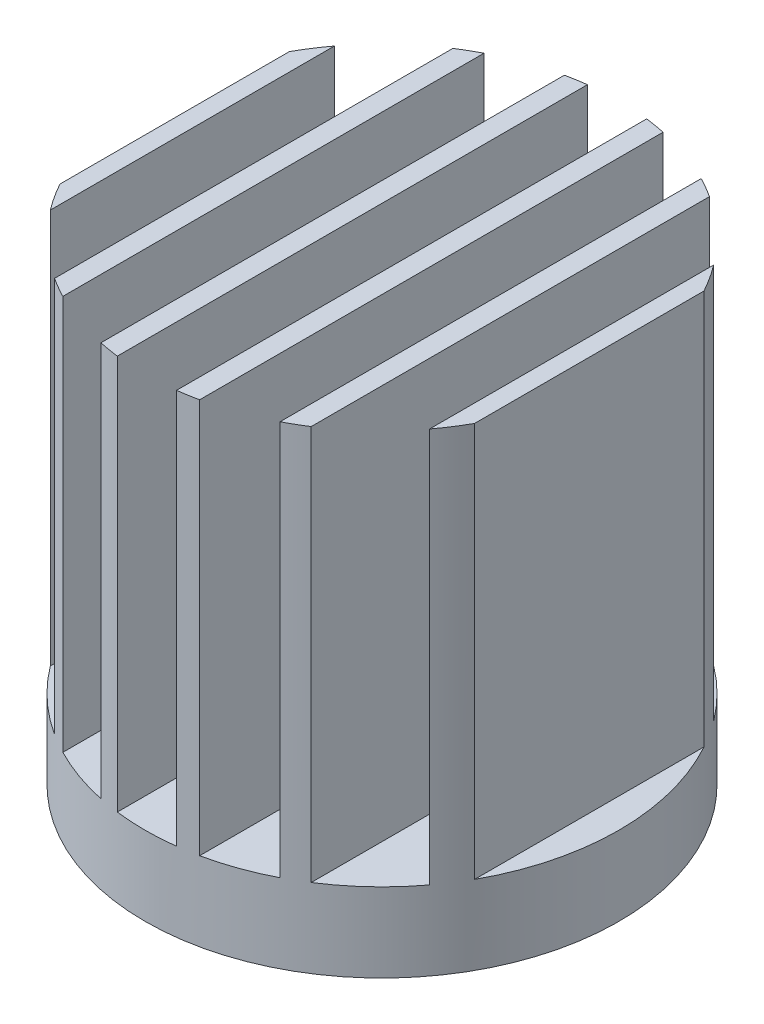
ISO-10303-21;
HEADER;
FILE_DESCRIPTION(('STEP AP214'),'2;1');
FILE_NAME('part.step','',(''),(''),'','','');
FILE_SCHEMA(('AUTOMOTIVE_DESIGN { 1 0 10303 214 1 1 1 1 }'));
ENDSEC;
DATA;
#1=APPLICATION_CONTEXT('core data for automotive mechanical design processes');
#2=APPLICATION_PROTOCOL_DEFINITION('international standard','automotive_design',2000,#1);
#3=PRODUCT_CONTEXT('',#1,'mechanical');
#4=PRODUCT('Part','Part','',(#3));
#5=PRODUCT_RELATED_PRODUCT_CATEGORY('part','',(#4));
#6=PRODUCT_DEFINITION_FORMATION('','',#4);
#7=PRODUCT_DEFINITION_CONTEXT('part definition',#1,'design');
#8=PRODUCT_DEFINITION('design','',#6,#7);
#9=PRODUCT_DEFINITION_SHAPE('','',#8);
#10=(LENGTH_UNIT() NAMED_UNIT(*) SI_UNIT(.MILLI.,.METRE.));
#11=(NAMED_UNIT(*) PLANE_ANGLE_UNIT() SI_UNIT($,.RADIAN.));
#12=(NAMED_UNIT(*) SI_UNIT($,.STERADIAN.) SOLID_ANGLE_UNIT());
#13=UNCERTAINTY_MEASURE_WITH_UNIT(LENGTH_MEASURE(1.E-05),#10,'distance_accuracy_value','');
#14=(GEOMETRIC_REPRESENTATION_CONTEXT(3) GLOBAL_UNCERTAINTY_ASSIGNED_CONTEXT((#13)) GLOBAL_UNIT_ASSIGNED_CONTEXT((#10,
#11,#12)) REPRESENTATION_CONTEXT('',''));
#15=CARTESIAN_POINT('',(0.,0.,0.));
#16=DIRECTION('',(0.,0.,1.));
#17=DIRECTION('',(1.,0.,0.));
#18=AXIS2_PLACEMENT_3D('',#15,#16,#17);
#19=CARTESIAN_POINT('',(0.,120.,0.));
#20=DIRECTION('',(0.,1.,0.));
#21=DIRECTION('',(0.,0.,1.));
#22=AXIS2_PLACEMENT_3D('',#19,#20,#21);
#23=PLANE('',#22);
#24=DIRECTION('',(0.,0.,1.));
#25=VECTOR('',#24,1.);
#26=CARTESIAN_POINT('',(-27.5,120.,0.));
#27=LINE('',#26,#25);
#28=CARTESIAN_POINT('',(-27.5,120.,-53.3268225192539));
#29=VERTEX_POINT('',#28);
#30=CARTESIAN_POINT('',(-27.5,120.,53.3268225192539));
#31=VERTEX_POINT('',#30);
#32=EDGE_CURVE('E265',#29,#31,#27,.T.);
#33=ORIENTED_EDGE('',*,*,#32,.F.);
#34=CARTESIAN_POINT('',(0.,120.,0.));
#35=DIRECTION('',(0.,1.,0.));
#36=DIRECTION('',(0.,0.,1.));
#37=AXIS2_PLACEMENT_3D('',#34,#35,#36);
#38=CIRCLE('',#37,60.);
#39=CARTESIAN_POINT('',(-32.5,120.,-50.43560250458));
#40=VERTEX_POINT('',#39);
#41=EDGE_CURVE('E398',#29,#40,#38,.T.);
#42=ORIENTED_EDGE('',*,*,#41,.T.);
#43=DIRECTION('',(0.,0.,-1.));
#44=VECTOR('',#43,1.);
#45=CARTESIAN_POINT('',(-32.5,120.,0.));
#46=LINE('',#45,#44);
#47=CARTESIAN_POINT('',(-32.5,120.,50.43560250458));
#48=VERTEX_POINT('',#47);
#49=EDGE_CURVE('E257',#48,#40,#46,.T.);
#50=ORIENTED_EDGE('',*,*,#49,.F.);
#51=EDGE_CURVE('E243',#48,#31,#38,.T.);
#52=ORIENTED_EDGE('',*,*,#51,.T.);
#53=EDGE_LOOP('',(#33,#42,#50,#52));
#54=FACE_BOUND('',#53,.T.);
#55=ADVANCED_FACE('F45',(#54),#23,.T.);
#56=DIRECTION('',(0.,0.,-1.));
#57=VECTOR('',#56,1.);
#58=CARTESIAN_POINT('',(27.5,120.,0.));
#59=LINE('',#58,#57);
#60=CARTESIAN_POINT('',(27.5,120.,53.3268225192539));
#61=VERTEX_POINT('',#60);
#62=CARTESIAN_POINT('',(27.5,120.,-53.3268225192539));
#63=VERTEX_POINT('',#62);
#64=EDGE_CURVE('E261',#61,#63,#59,.T.);
#65=ORIENTED_EDGE('',*,*,#64,.F.);
#66=CARTESIAN_POINT('',(32.5,120.,50.43560250458));
#67=VERTEX_POINT('',#66);
#68=EDGE_CURVE('E234',#61,#67,#38,.T.);
#69=ORIENTED_EDGE('',*,*,#68,.T.);
#70=DIRECTION('',(0.,0.,1.));
#71=VECTOR('',#70,1.);
#72=CARTESIAN_POINT('',(32.5,120.,0.));
#73=LINE('',#72,#71);
#74=CARTESIAN_POINT('',(32.5,120.,-50.43560250458));
#75=VERTEX_POINT('',#74);
#76=EDGE_CURVE('E249',#75,#67,#73,.T.);
#77=ORIENTED_EDGE('',*,*,#76,.F.);
#78=EDGE_CURVE('E238',#75,#63,#38,.T.);
#79=ORIENTED_EDGE('',*,*,#78,.T.);
#80=EDGE_LOOP('',(#65,#69,#77,#79));
#81=FACE_BOUND('',#80,.T.);
#82=ADVANCED_FACE('F447',(#81),#23,.T.);
#83=DIRECTION('',(0.,0.,-1.));
#84=VECTOR('',#83,1.);
#85=CARTESIAN_POINT('',(-12.5,120.,0.));
#86=LINE('',#85,#84);
#87=CARTESIAN_POINT('',(-12.5,120.,58.6834729715275));
#88=VERTEX_POINT('',#87);
#89=CARTESIAN_POINT('',(-12.5,120.,-58.6834729715275));
#90=VERTEX_POINT('',#89);
#91=EDGE_CURVE('E263',#88,#90,#86,.T.);
#92=ORIENTED_EDGE('',*,*,#91,.F.);
#93=CARTESIAN_POINT('',(-7.5,120.,59.5294044989533));
#94=VERTEX_POINT('',#93);
#95=EDGE_CURVE('E239',#88,#94,#38,.T.);
#96=ORIENTED_EDGE('',*,*,#95,.T.);
#97=DIRECTION('',(0.,0.,1.));
#98=VECTOR('',#97,1.);
#99=CARTESIAN_POINT('',(-7.5,120.,0.));
#100=LINE('',#99,#98);
#101=CARTESIAN_POINT('',(-7.5,120.,-59.5294044989533));
#102=VERTEX_POINT('',#101);
#103=EDGE_CURVE('E251',#102,#94,#100,.T.);
#104=ORIENTED_EDGE('',*,*,#103,.F.);
#105=EDGE_CURVE('E419',#102,#90,#38,.T.);
#106=ORIENTED_EDGE('',*,*,#105,.T.);
#107=EDGE_LOOP('',(#92,#96,#104,#106));
#108=FACE_BOUND('',#107,.T.);
#109=ADVANCED_FACE('F416',(#108),#23,.T.);
#110=DIRECTION('',(0.,0.,1.));
#111=VECTOR('',#110,1.);
#112=CARTESIAN_POINT('',(12.5,120.,0.));
#113=LINE('',#112,#111);
#114=CARTESIAN_POINT('',(12.5,120.,-58.6834729715275));
#115=VERTEX_POINT('',#114);
#116=CARTESIAN_POINT('',(12.5,120.,58.6834729715275));
#117=VERTEX_POINT('',#116);
#118=EDGE_CURVE('E259',#115,#117,#113,.T.);
#119=ORIENTED_EDGE('',*,*,#118,.F.);
#120=CARTESIAN_POINT('',(7.5,120.,-59.5294044989533));
#121=VERTEX_POINT('',#120);
#122=EDGE_CURVE('E421',#115,#121,#38,.T.);
#123=ORIENTED_EDGE('',*,*,#122,.T.);
#124=DIRECTION('',(0.,0.,-1.));
#125=VECTOR('',#124,1.);
#126=CARTESIAN_POINT('',(7.5,120.,0.));
#127=LINE('',#126,#125);
#128=CARTESIAN_POINT('',(7.5,120.,59.5294044989533));
#129=VERTEX_POINT('',#128);
#130=EDGE_CURVE('E253',#129,#121,#127,.T.);
#131=ORIENTED_EDGE('',*,*,#130,.F.);
#132=EDGE_CURVE('E221',#129,#117,#38,.T.);
#133=ORIENTED_EDGE('',*,*,#132,.T.);
#134=EDGE_LOOP('',(#119,#123,#131,#133));
#135=FACE_BOUND('',#134,.T.);
#136=ADVANCED_FACE('F463',(#135),#23,.T.);
#137=DIRECTION('',(0.,0.,-1.));
#138=VECTOR('',#137,1.);
#139=CARTESIAN_POINT('',(-52.5,120.,0.));
#140=LINE('',#139,#138);
#141=CARTESIAN_POINT('',(-52.5,120.,29.0473750965556));
#142=VERTEX_POINT('',#141);
#143=CARTESIAN_POINT('',(-52.5,120.,-29.0473750965556));
#144=VERTEX_POINT('',#143);
#145=EDGE_CURVE('E267',#142,#144,#140,.T.);
#146=ORIENTED_EDGE('',*,*,#145,.F.);
#147=CARTESIAN_POINT('',(-48.0171697935705,120.,35.9770955611403));
#148=VERTEX_POINT('',#147);
#149=EDGE_CURVE('E394',#142,#148,#38,.T.);
#150=ORIENTED_EDGE('',*,*,#149,.T.);
#151=DIRECTION('',(0.,0.,1.));
#152=VECTOR('',#151,1.);
#153=CARTESIAN_POINT('',(-48.0171697935705,120.,0.));
#154=LINE('',#153,#152);
#155=CARTESIAN_POINT('',(-48.0171697935705,120.,-35.9770955611403));
#156=VERTEX_POINT('',#155);
#157=EDGE_CURVE('E255',#156,#148,#154,.T.);
#158=ORIENTED_EDGE('',*,*,#157,.F.);
#159=EDGE_CURVE('E397',#156,#144,#38,.T.);
#160=ORIENTED_EDGE('',*,*,#159,.T.);
#161=EDGE_LOOP('',(#146,#150,#158,#160));
#162=FACE_BOUND('',#161,.T.);
#163=ADVANCED_FACE('F432',(#162),#23,.T.);
#164=CARTESIAN_POINT('',(0.,120.,0.));
#165=DIRECTION('',(0.,-1.,0.));
#166=DIRECTION('',(0.,0.,-1.));
#167=AXIS2_PLACEMENT_3D('',#164,#165,#166);
#168=CYLINDRICAL_SURFACE('',#167,60.);
#169=ORIENTED_EDGE('',*,*,#149,.F.);
#170=DIRECTION('',(0.,-1.,0.));
#171=VECTOR('',#170,1.);
#172=CARTESIAN_POINT('',(-52.5,120.,29.0473750965557));
#173=LINE('',#172,#171);
#174=CARTESIAN_POINT('',(-52.5,20.,29.0473750965556));
#175=VERTEX_POINT('',#174);
#176=EDGE_CURVE('E68',#142,#175,#173,.T.);
#177=ORIENTED_EDGE('',*,*,#176,.T.);
#178=CARTESIAN_POINT('',(0.,20.,0.));
#179=DIRECTION('',(0.,-1.,0.));
#180=DIRECTION('',(1.,0.,0.));
#181=AXIS2_PLACEMENT_3D('',#178,#179,#180);
#182=CIRCLE('',#181,60.);
#183=CARTESIAN_POINT('',(-52.5,20.,-29.0473750965556));
#184=VERTEX_POINT('',#183);
#185=EDGE_CURVE('E11',#175,#184,#182,.T.);
#186=ORIENTED_EDGE('',*,*,#185,.T.);
#187=DIRECTION('',(0.,-1.,0.));
#188=VECTOR('',#187,1.);
#189=CARTESIAN_POINT('',(-52.5,120.,-29.0473750965557));
#190=LINE('',#189,#188);
#191=EDGE_CURVE('E389',#184,#144,#190,.F.);
#192=ORIENTED_EDGE('',*,*,#191,.T.);
#193=ORIENTED_EDGE('',*,*,#159,.F.);
#194=DIRECTION('',(0.,-1.,0.));
#195=VECTOR('',#194,1.);
#196=CARTESIAN_POINT('',(-48.0171697935705,120.,-35.9770955611403));
#197=LINE('',#196,#195);
#198=CARTESIAN_POINT('',(-48.0171697935705,20.,-35.9770955611403));
#199=VERTEX_POINT('',#198);
#200=EDGE_CURVE('E367',#156,#199,#197,.T.);
#201=ORIENTED_EDGE('',*,*,#200,.T.);
#202=CARTESIAN_POINT('',(0.,20.,0.));
#203=DIRECTION('',(0.,-1.,0.));
#204=DIRECTION('',(0.,0.,-1.));
#205=AXIS2_PLACEMENT_3D('',#202,#203,#204);
#206=CIRCLE('',#205,60.);
#207=CARTESIAN_POINT('',(-32.5,20.,-50.43560250458));
#208=VERTEX_POINT('',#207);
#209=EDGE_CURVE('E281',#199,#208,#206,.T.);
#210=ORIENTED_EDGE('',*,*,#209,.T.);
#211=DIRECTION('',(0.,-1.,0.));
#212=VECTOR('',#211,1.);
#213=CARTESIAN_POINT('',(-32.5,120.,-50.43560250458));
#214=LINE('',#213,#212);
#215=EDGE_CURVE('E370',#208,#40,#214,.F.);
#216=ORIENTED_EDGE('',*,*,#215,.T.);
#217=ORIENTED_EDGE('',*,*,#41,.F.);
#218=DIRECTION('',(0.,-1.,0.));
#219=VECTOR('',#218,1.);
#220=CARTESIAN_POINT('',(-27.5,120.,-53.3268225192539));
#221=LINE('',#220,#219);
#222=CARTESIAN_POINT('',(-27.5,20.,-53.3268225192539));
#223=VERTEX_POINT('',#222);
#224=EDGE_CURVE('E388',#29,#223,#221,.T.);
#225=ORIENTED_EDGE('',*,*,#224,.T.);
#226=CARTESIAN_POINT('',(0.,20.,0.));
#227=DIRECTION('',(0.,-1.,0.));
#228=DIRECTION('',(0.,0.,-1.));
#229=AXIS2_PLACEMENT_3D('',#226,#227,#228);
#230=CIRCLE('',#229,60.);
#231=CARTESIAN_POINT('',(-12.5,20.,-58.6834729715275));
#232=VERTEX_POINT('',#231);
#233=EDGE_CURVE('E285',#223,#232,#230,.T.);
#234=ORIENTED_EDGE('',*,*,#233,.T.);
#235=DIRECTION('',(0.,-1.,0.));
#236=VECTOR('',#235,1.);
#237=CARTESIAN_POINT('',(-12.5,120.,-58.6834729715275));
#238=LINE('',#237,#236);
#239=EDGE_CURVE('E382',#232,#90,#238,.F.);
#240=ORIENTED_EDGE('',*,*,#239,.T.);
#241=ORIENTED_EDGE('',*,*,#105,.F.);
#242=DIRECTION('',(0.,-1.,0.));
#243=VECTOR('',#242,1.);
#244=CARTESIAN_POINT('',(-7.5,120.,-59.5294044989533));
#245=LINE('',#244,#243);
#246=CARTESIAN_POINT('',(-7.49999999999999,20.,-59.5294044989533));
#247=VERTEX_POINT('',#246);
#248=EDGE_CURVE('E355',#102,#247,#245,.T.);
#249=ORIENTED_EDGE('',*,*,#248,.T.);
#250=CARTESIAN_POINT('',(0.,20.,0.));
#251=DIRECTION('',(0.,-1.,0.));
#252=DIRECTION('',(1.,0.,0.));
#253=AXIS2_PLACEMENT_3D('',#250,#251,#252);
#254=CIRCLE('',#253,60.);
#255=CARTESIAN_POINT('',(7.49999999999999,20.0000000000001,-59.5294044989533));
#256=VERTEX_POINT('',#255);
#257=EDGE_CURVE('E277',#247,#256,#254,.T.);
#258=ORIENTED_EDGE('',*,*,#257,.T.);
#259=DIRECTION('',(0.,-1.,0.));
#260=VECTOR('',#259,1.);
#261=CARTESIAN_POINT('',(7.5,120.,-59.5294044989533));
#262=LINE('',#261,#260);
#263=EDGE_CURVE('E358',#256,#121,#262,.F.);
#264=ORIENTED_EDGE('',*,*,#263,.T.);
#265=ORIENTED_EDGE('',*,*,#122,.F.);
#266=DIRECTION('',(0.,-1.,0.));
#267=VECTOR('',#266,1.);
#268=CARTESIAN_POINT('',(12.5,120.,-58.6834729715275));
#269=LINE('',#268,#267);
#270=CARTESIAN_POINT('',(12.5,20.0000000000001,-58.6834729715275));
#271=VERTEX_POINT('',#270);
#272=EDGE_CURVE('E297',#115,#271,#269,.T.);
#273=ORIENTED_EDGE('',*,*,#272,.T.);
#274=CARTESIAN_POINT('',(0.,20.0000000000001,0.));
#275=DIRECTION('',(0.,-1.,0.));
#276=DIRECTION('',(0.,0.,-1.));
#277=AXIS2_PLACEMENT_3D('',#274,#275,#276);
#278=CIRCLE('',#277,60.);
#279=CARTESIAN_POINT('',(27.5,20.0000000000001,-53.3268225192539));
#280=VERTEX_POINT('',#279);
#281=EDGE_CURVE('E284',#271,#280,#278,.T.);
#282=ORIENTED_EDGE('',*,*,#281,.T.);
#283=DIRECTION('',(0.,-1.,0.));
#284=VECTOR('',#283,1.);
#285=CARTESIAN_POINT('',(27.5,120.,-53.3268225192539));
#286=LINE('',#285,#284);
#287=EDGE_CURVE('E294',#280,#63,#286,.F.);
#288=ORIENTED_EDGE('',*,*,#287,.T.);
#289=ORIENTED_EDGE('',*,*,#78,.F.);
#290=DIRECTION('',(0.,-1.,0.));
#291=VECTOR('',#290,1.);
#292=CARTESIAN_POINT('',(32.5,120.,-50.43560250458));
#293=LINE('',#292,#291);
#294=CARTESIAN_POINT('',(32.5,20.0000000000001,-50.43560250458));
#295=VERTEX_POINT('',#294);
#296=EDGE_CURVE('E349',#75,#295,#293,.T.);
#297=ORIENTED_EDGE('',*,*,#296,.T.);
#298=CARTESIAN_POINT('',(0.,20.0000000000001,0.));
#299=DIRECTION('',(0.,-1.,0.));
#300=DIRECTION('',(0.,0.,-1.));
#301=AXIS2_PLACEMENT_3D('',#298,#299,#300);
#302=CIRCLE('',#301,60.);
#303=CARTESIAN_POINT('',(48.0171697935705,20.0000000000001,-35.9770955611403));
#304=VERTEX_POINT('',#303);
#305=EDGE_CURVE('E273',#295,#304,#302,.T.);
#306=ORIENTED_EDGE('',*,*,#305,.T.);
#307=DIRECTION('',(0.,-1.,0.));
#308=VECTOR('',#307,1.);
#309=CARTESIAN_POINT('',(48.0171697935705,120.,-35.9770955611403));
#310=LINE('',#309,#308);
#311=CARTESIAN_POINT('',(48.0171697935705,120.,-35.9770955611403));
#312=VERTEX_POINT('',#311);
#313=EDGE_CURVE('E341',#304,#312,#310,.F.);
#314=ORIENTED_EDGE('',*,*,#313,.T.);
#315=CARTESIAN_POINT('',(52.5,120.,-29.0473750965556));
#316=VERTEX_POINT('',#315);
#317=EDGE_CURVE('E235',#316,#312,#38,.T.);
#318=ORIENTED_EDGE('',*,*,#317,.F.);
#319=DIRECTION('',(0.,-1.,0.));
#320=VECTOR('',#319,1.);
#321=CARTESIAN_POINT('',(52.5,120.,-29.0473750965556));
#322=LINE('',#321,#320);
#323=CARTESIAN_POINT('',(52.5,20.0000000000001,-29.0473750965556));
#324=VERTEX_POINT('',#323);
#325=EDGE_CURVE('E215',#316,#324,#322,.T.);
#326=ORIENTED_EDGE('',*,*,#325,.T.);
#327=CARTESIAN_POINT('',(0.,20.,0.));
#328=DIRECTION('',(0.,-1.,0.));
#329=DIRECTION('',(1.,0.,0.));
#330=AXIS2_PLACEMENT_3D('',#327,#328,#329);
#331=CIRCLE('',#330,60.);
#332=CARTESIAN_POINT('',(52.5,20.0000000000001,29.0473750965556));
#333=VERTEX_POINT('',#332);
#334=EDGE_CURVE('E229',#324,#333,#331,.T.);
#335=ORIENTED_EDGE('',*,*,#334,.T.);
#336=DIRECTION('',(0.,-1.,0.));
#337=VECTOR('',#336,1.);
#338=CARTESIAN_POINT('',(52.5,120.,29.0473750965556));
#339=LINE('',#338,#337);
#340=CARTESIAN_POINT('',(52.5,120.,29.0473750965556));
#341=VERTEX_POINT('',#340);
#342=EDGE_CURVE('E212',#333,#341,#339,.F.);
#343=ORIENTED_EDGE('',*,*,#342,.T.);
#344=CARTESIAN_POINT('',(48.0171697935705,120.,35.9770955611403));
#345=VERTEX_POINT('',#344);
#346=EDGE_CURVE('E228',#345,#341,#38,.T.);
#347=ORIENTED_EDGE('',*,*,#346,.F.);
#348=DIRECTION('',(0.,-1.,0.));
#349=VECTOR('',#348,1.);
#350=CARTESIAN_POINT('',(48.0171697935705,120.,35.9770955611403));
#351=LINE('',#350,#349);
#352=CARTESIAN_POINT('',(48.0171697935705,20.0000000000001,35.9770955611403));
#353=VERTEX_POINT('',#352);
#354=EDGE_CURVE('E344',#345,#353,#351,.T.);
#355=ORIENTED_EDGE('',*,*,#354,.T.);
#356=CARTESIAN_POINT('',(32.5,20.0000000000001,50.43560250458));
#357=VERTEX_POINT('',#356);
#358=EDGE_CURVE('E270',#353,#357,#302,.T.);
#359=ORIENTED_EDGE('',*,*,#358,.T.);
#360=DIRECTION('',(0.,-1.,0.));
#361=VECTOR('',#360,1.);
#362=CARTESIAN_POINT('',(32.5,120.,50.43560250458));
#363=LINE('',#362,#361);
#364=EDGE_CURVE('E346',#357,#67,#363,.F.);
#365=ORIENTED_EDGE('',*,*,#364,.T.);
#366=ORIENTED_EDGE('',*,*,#68,.F.);
#367=DIRECTION('',(0.,-1.,0.));
#368=VECTOR('',#367,1.);
#369=CARTESIAN_POINT('',(27.5,120.,53.3268225192539));
#370=LINE('',#369,#368);
#371=CARTESIAN_POINT('',(27.5,20.0000000000001,53.3268225192539));
#372=VERTEX_POINT('',#371);
#373=EDGE_CURVE('E379',#61,#372,#370,.T.);
#374=ORIENTED_EDGE('',*,*,#373,.T.);
#375=CARTESIAN_POINT('',(12.5,20.0000000000001,58.6834729715275));
#376=VERTEX_POINT('',#375);
#377=EDGE_CURVE('E282',#372,#376,#278,.T.);
#378=ORIENTED_EDGE('',*,*,#377,.T.);
#379=DIRECTION('',(0.,-1.,0.));
#380=VECTOR('',#379,1.);
#381=CARTESIAN_POINT('',(12.5,120.,58.6834729715275));
#382=LINE('',#381,#380);
#383=EDGE_CURVE('E310',#376,#117,#382,.F.);
#384=ORIENTED_EDGE('',*,*,#383,.T.);
#385=ORIENTED_EDGE('',*,*,#132,.F.);
#386=DIRECTION('',(0.,-1.,0.));
#387=VECTOR('',#386,1.);
#388=CARTESIAN_POINT('',(7.5,120.,59.5294044989533));
#389=LINE('',#388,#387);
#390=CARTESIAN_POINT('',(7.49999999999999,20.0000000000001,59.5294044989533));
#391=VERTEX_POINT('',#390);
#392=EDGE_CURVE('E361',#129,#391,#389,.T.);
#393=ORIENTED_EDGE('',*,*,#392,.T.);
#394=CARTESIAN_POINT('',(-7.49999999999999,20.,59.5294044989533));
#395=VERTEX_POINT('',#394);
#396=EDGE_CURVE('E274',#391,#395,#254,.T.);
#397=ORIENTED_EDGE('',*,*,#396,.T.);
#398=DIRECTION('',(0.,-1.,0.));
#399=VECTOR('',#398,1.);
#400=CARTESIAN_POINT('',(-7.5,120.,59.5294044989533));
#401=LINE('',#400,#399);
#402=EDGE_CURVE('E352',#395,#94,#401,.F.);
#403=ORIENTED_EDGE('',*,*,#402,.T.);
#404=ORIENTED_EDGE('',*,*,#95,.F.);
#405=DIRECTION('',(0.,-1.,0.));
#406=VECTOR('',#405,1.);
#407=CARTESIAN_POINT('',(-12.5,120.,58.6834729715275));
#408=LINE('',#407,#406);
#409=CARTESIAN_POINT('',(-12.5,20.,58.6834729715275));
#410=VERTEX_POINT('',#409);
#411=EDGE_CURVE('E60',#88,#410,#408,.T.);
#412=ORIENTED_EDGE('',*,*,#411,.T.);
#413=CARTESIAN_POINT('',(-27.5,20.,53.3268225192539));
#414=VERTEX_POINT('',#413);
#415=EDGE_CURVE('E53',#410,#414,#230,.T.);
#416=ORIENTED_EDGE('',*,*,#415,.T.);
#417=DIRECTION('',(0.,-1.,0.));
#418=VECTOR('',#417,1.);
#419=CARTESIAN_POINT('',(-27.5,120.,53.3268225192539));
#420=LINE('',#419,#418);
#421=EDGE_CURVE('E385',#414,#31,#420,.F.);
#422=ORIENTED_EDGE('',*,*,#421,.T.);
#423=ORIENTED_EDGE('',*,*,#51,.F.);
#424=DIRECTION('',(0.,-1.,0.));
#425=VECTOR('',#424,1.);
#426=CARTESIAN_POINT('',(-32.5,120.,50.43560250458));
#427=LINE('',#426,#425);
#428=CARTESIAN_POINT('',(-32.5,20.,50.43560250458));
#429=VERTEX_POINT('',#428);
#430=EDGE_CURVE('E373',#48,#429,#427,.T.);
#431=ORIENTED_EDGE('',*,*,#430,.T.);
#432=CARTESIAN_POINT('',(-48.0171697935705,20.,35.9770955611403));
#433=VERTEX_POINT('',#432);
#434=EDGE_CURVE('E278',#429,#433,#206,.T.);
#435=ORIENTED_EDGE('',*,*,#434,.T.);
#436=DIRECTION('',(0.,-1.,0.));
#437=VECTOR('',#436,1.);
#438=CARTESIAN_POINT('',(-48.0171697935705,120.,35.9770955611403));
#439=LINE('',#438,#437);
#440=EDGE_CURVE('E364',#433,#148,#439,.F.);
#441=ORIENTED_EDGE('',*,*,#440,.T.);
#442=EDGE_LOOP('',(#169,#177,#186,#192,#193,#201,#210,#216,#217,#225,#234,#240,#241,#249,#258,
#264,#265,#273,#282,#288,#289,#297,#306,#314,#318,#326,#335,#343,#347,#355,#359,#365,#366,#374,
#378,#384,#385,#393,#397,#403,#404,#412,#416,#422,#423,#431,#435,#441));
#443=FACE_BOUND('',#442,.T.);
#444=CARTESIAN_POINT('',(0.,0.,0.));
#445=DIRECTION('',(0.,1.,0.));
#446=DIRECTION('',(0.,0.,1.));
#447=AXIS2_PLACEMENT_3D('',#444,#445,#446);
#448=CIRCLE('',#447,60.);
#449=CARTESIAN_POINT('',(0.,0.,60.));
#450=VERTEX_POINT('',#449);
#451=EDGE_CURVE('E244',#450,#450,#448,.T.);
#452=ORIENTED_EDGE('',*,*,#451,.T.);
#453=EDGE_LOOP('',(#452));
#454=FACE_BOUND('',#453,.T.);
#455=ADVANCED_FACE('F47',(#443,#454),#168,.T.);
#456=DIRECTION('',(0.,0.,-1.));
#457=VECTOR('',#456,1.);
#458=CARTESIAN_POINT('',(48.0171697935705,120.,0.));
#459=LINE('',#458,#457);
#460=EDGE_CURVE('E220',#345,#312,#459,.T.);
#461=ORIENTED_EDGE('',*,*,#460,.F.);
#462=ORIENTED_EDGE('',*,*,#346,.T.);
#463=DIRECTION('',(0.,0.,1.));
#464=VECTOR('',#463,1.);
#465=CARTESIAN_POINT('',(52.5,120.,0.));
#466=LINE('',#465,#464);
#467=EDGE_CURVE('E208',#316,#341,#466,.T.);
#468=ORIENTED_EDGE('',*,*,#467,.F.);
#469=ORIENTED_EDGE('',*,*,#317,.T.);
#470=EDGE_LOOP('',(#461,#462,#468,#469));
#471=FACE_BOUND('',#470,.T.);
#472=ADVANCED_FACE('F233',(#471),#23,.T.);
#473=CARTESIAN_POINT('',(0.,0.,0.));
#474=DIRECTION('',(0.,1.,0.));
#475=DIRECTION('',(0.,0.,1.));
#476=AXIS2_PLACEMENT_3D('',#473,#474,#475);
#477=PLANE('',#476);
#478=ORIENTED_EDGE('',*,*,#451,.F.);
#479=EDGE_LOOP('',(#478));
#480=FACE_BOUND('',#479,.T.);
#481=ADVANCED_FACE('F455',(#480),#477,.F.);
#482=CARTESIAN_POINT('',(52.5,20.0000000000001,-60.));
#483=DIRECTION('',(0.,-1.,0.));
#484=DIRECTION('',(1.,0.,0.));
#485=AXIS2_PLACEMENT_3D('',#482,#483,#484);
#486=PLANE('',#485);
#487=ORIENTED_EDGE('',*,*,#334,.F.);
#488=DIRECTION('',(0.,0.,1.));
#489=VECTOR('',#488,1.);
#490=CARTESIAN_POINT('',(52.5,20.0000000000001,-60.));
#491=LINE('',#490,#489);
#492=EDGE_CURVE('E338',#324,#333,#491,.T.);
#493=ORIENTED_EDGE('',*,*,#492,.T.);
#494=EDGE_LOOP('',(#487,#493));
#495=FACE_BOUND('',#494,.T.);
#496=ADVANCED_FACE('F460',(#495),#486,.F.);
#497=CARTESIAN_POINT('',(52.5,20.0000000000001,-60.));
#498=DIRECTION('',(-1.,0.,0.));
#499=DIRECTION('',(0.,-1.,0.));
#500=AXIS2_PLACEMENT_3D('',#497,#498,#499);
#501=PLANE('',#500);
#502=ORIENTED_EDGE('',*,*,#467,.T.);
#503=ORIENTED_EDGE('',*,*,#342,.F.);
#504=ORIENTED_EDGE('',*,*,#492,.F.);
#505=ORIENTED_EDGE('',*,*,#325,.F.);
#506=EDGE_LOOP('',(#502,#503,#504,#505));
#507=FACE_BOUND('',#506,.T.);
#508=ADVANCED_FACE('F210',(#507),#501,.F.);
#509=CARTESIAN_POINT('',(32.5,20.0000000000001,-60.));
#510=DIRECTION('',(0.,-1.,0.));
#511=DIRECTION('',(0.,0.,-1.));
#512=AXIS2_PLACEMENT_3D('',#509,#510,#511);
#513=PLANE('',#512);
#514=DIRECTION('',(0.,0.,1.));
#515=VECTOR('',#514,1.);
#516=CARTESIAN_POINT('',(32.5,20.0000000000001,-60.));
#517=LINE('',#516,#515);
#518=EDGE_CURVE('E335',#295,#357,#517,.T.);
#519=ORIENTED_EDGE('',*,*,#518,.T.);
#520=ORIENTED_EDGE('',*,*,#358,.F.);
#521=DIRECTION('',(0.,0.,1.));
#522=VECTOR('',#521,1.);
#523=CARTESIAN_POINT('',(48.0171697935705,20.0000000000001,-60.));
#524=LINE('',#523,#522);
#525=EDGE_CURVE('E321',#304,#353,#524,.T.);
#526=ORIENTED_EDGE('',*,*,#525,.F.);
#527=ORIENTED_EDGE('',*,*,#305,.F.);
#528=EDGE_LOOP('',(#519,#520,#526,#527));
#529=FACE_BOUND('',#528,.T.);
#530=ADVANCED_FACE('F489',(#529),#513,.F.);
#531=CARTESIAN_POINT('',(32.5,120.,-60.));
#532=DIRECTION('',(-1.,0.,0.));
#533=DIRECTION('',(0.,-1.,0.));
#534=AXIS2_PLACEMENT_3D('',#531,#532,#533);
#535=PLANE('',#534);
#536=ORIENTED_EDGE('',*,*,#76,.T.);
#537=ORIENTED_EDGE('',*,*,#364,.F.);
#538=ORIENTED_EDGE('',*,*,#518,.F.);
#539=ORIENTED_EDGE('',*,*,#296,.F.);
#540=EDGE_LOOP('',(#536,#537,#538,#539));
#541=FACE_BOUND('',#540,.T.);
#542=ADVANCED_FACE('F487',(#541),#535,.F.);
#543=CARTESIAN_POINT('',(48.0171697935705,120.,-60.));
#544=DIRECTION('',(1.,0.,0.));
#545=DIRECTION('',(0.,0.,-1.));
#546=AXIS2_PLACEMENT_3D('',#543,#544,#545);
#547=PLANE('',#546);
#548=ORIENTED_EDGE('',*,*,#460,.T.);
#549=ORIENTED_EDGE('',*,*,#313,.F.);
#550=ORIENTED_EDGE('',*,*,#525,.T.);
#551=ORIENTED_EDGE('',*,*,#354,.F.);
#552=EDGE_LOOP('',(#548,#549,#550,#551));
#553=FACE_BOUND('',#552,.T.);
#554=ADVANCED_FACE('F493',(#553),#547,.F.);
#555=CARTESIAN_POINT('',(7.49999999999999,20.0000000000001,-60.));
#556=DIRECTION('',(0.,-1.,0.));
#557=DIRECTION('',(1.,0.,0.));
#558=AXIS2_PLACEMENT_3D('',#555,#556,#557);
#559=PLANE('',#558);
#560=DIRECTION('',(0.,0.,1.));
#561=VECTOR('',#560,1.);
#562=CARTESIAN_POINT('',(7.49999999999999,20.0000000000001,-60.));
#563=LINE('',#562,#561);
#564=EDGE_CURVE('E322',#256,#391,#563,.T.);
#565=ORIENTED_EDGE('',*,*,#564,.F.);
#566=ORIENTED_EDGE('',*,*,#257,.F.);
#567=DIRECTION('',(0.,0.,1.));
#568=VECTOR('',#567,1.);
#569=CARTESIAN_POINT('',(-7.49999999999999,20.,-60.));
#570=LINE('',#569,#568);
#571=EDGE_CURVE('E325',#247,#395,#570,.T.);
#572=ORIENTED_EDGE('',*,*,#571,.T.);
#573=ORIENTED_EDGE('',*,*,#396,.F.);
#574=EDGE_LOOP('',(#565,#566,#572,#573));
#575=FACE_BOUND('',#574,.T.);
#576=ADVANCED_FACE('F478',(#575),#559,.F.);
#577=CARTESIAN_POINT('',(7.5,120.,-60.));
#578=DIRECTION('',(1.,0.,0.));
#579=DIRECTION('',(0.,1.,0.));
#580=AXIS2_PLACEMENT_3D('',#577,#578,#579);
#581=PLANE('',#580);
#582=ORIENTED_EDGE('',*,*,#130,.T.);
#583=ORIENTED_EDGE('',*,*,#263,.F.);
#584=ORIENTED_EDGE('',*,*,#564,.T.);
#585=ORIENTED_EDGE('',*,*,#392,.F.);
#586=EDGE_LOOP('',(#582,#583,#584,#585));
#587=FACE_BOUND('',#586,.T.);
#588=ADVANCED_FACE('F476',(#587),#581,.F.);
#589=CARTESIAN_POINT('',(-7.5,120.,-60.));
#590=DIRECTION('',(-1.,0.,0.));
#591=DIRECTION('',(0.,-1.,0.));
#592=AXIS2_PLACEMENT_3D('',#589,#590,#591);
#593=PLANE('',#592);
#594=ORIENTED_EDGE('',*,*,#103,.T.);
#595=ORIENTED_EDGE('',*,*,#402,.F.);
#596=ORIENTED_EDGE('',*,*,#571,.F.);
#597=ORIENTED_EDGE('',*,*,#248,.F.);
#598=EDGE_LOOP('',(#594,#595,#596,#597));
#599=FACE_BOUND('',#598,.T.);
#600=ADVANCED_FACE('F538',(#599),#593,.F.);
#601=CARTESIAN_POINT('',(-32.5,20.,-60.));
#602=DIRECTION('',(0.,-1.,0.));
#603=DIRECTION('',(0.,0.,-1.));
#604=AXIS2_PLACEMENT_3D('',#601,#602,#603);
#605=PLANE('',#604);
#606=DIRECTION('',(0.,0.,1.));
#607=VECTOR('',#606,1.);
#608=CARTESIAN_POINT('',(-32.5,20.,-60.));
#609=LINE('',#608,#607);
#610=EDGE_CURVE('E328',#208,#429,#609,.T.);
#611=ORIENTED_EDGE('',*,*,#610,.F.);
#612=ORIENTED_EDGE('',*,*,#209,.F.);
#613=DIRECTION('',(0.,0.,1.));
#614=VECTOR('',#613,1.);
#615=CARTESIAN_POINT('',(-48.0171697935705,20.,-60.));
#616=LINE('',#615,#614);
#617=EDGE_CURVE('E313',#199,#433,#616,.T.);
#618=ORIENTED_EDGE('',*,*,#617,.T.);
#619=ORIENTED_EDGE('',*,*,#434,.F.);
#620=EDGE_LOOP('',(#611,#612,#618,#619));
#621=FACE_BOUND('',#620,.T.);
#622=ADVANCED_FACE('F428',(#621),#605,.F.);
#623=CARTESIAN_POINT('',(-32.5,120.,-60.));
#624=DIRECTION('',(1.,0.,0.));
#625=DIRECTION('',(0.,1.,0.));
#626=AXIS2_PLACEMENT_3D('',#623,#624,#625);
#627=PLANE('',#626);
#628=ORIENTED_EDGE('',*,*,#49,.T.);
#629=ORIENTED_EDGE('',*,*,#215,.F.);
#630=ORIENTED_EDGE('',*,*,#610,.T.);
#631=ORIENTED_EDGE('',*,*,#430,.F.);
#632=EDGE_LOOP('',(#628,#629,#630,#631));
#633=FACE_BOUND('',#632,.T.);
#634=ADVANCED_FACE('F426',(#633),#627,.F.);
#635=CARTESIAN_POINT('',(-48.0171697935705,120.,-60.));
#636=DIRECTION('',(-1.,0.,0.));
#637=DIRECTION('',(0.,0.,1.));
#638=AXIS2_PLACEMENT_3D('',#635,#636,#637);
#639=PLANE('',#638);
#640=ORIENTED_EDGE('',*,*,#157,.T.);
#641=ORIENTED_EDGE('',*,*,#440,.F.);
#642=ORIENTED_EDGE('',*,*,#617,.F.);
#643=ORIENTED_EDGE('',*,*,#200,.F.);
#644=EDGE_LOOP('',(#640,#641,#642,#643));
#645=FACE_BOUND('',#644,.T.);
#646=ADVANCED_FACE('F431',(#645),#639,.F.);
#647=CARTESIAN_POINT('',(27.5,20.0000000000001,-60.));
#648=DIRECTION('',(0.,-1.,0.));
#649=DIRECTION('',(0.,0.,-1.));
#650=AXIS2_PLACEMENT_3D('',#647,#648,#649);
#651=PLANE('',#650);
#652=DIRECTION('',(0.,0.,1.));
#653=VECTOR('',#652,1.);
#654=CARTESIAN_POINT('',(12.5,20.0000000000001,-60.));
#655=LINE('',#654,#653);
#656=EDGE_CURVE('E303',#271,#376,#655,.T.);
#657=ORIENTED_EDGE('',*,*,#656,.T.);
#658=ORIENTED_EDGE('',*,*,#377,.F.);
#659=DIRECTION('',(0.,0.,1.));
#660=VECTOR('',#659,1.);
#661=CARTESIAN_POINT('',(27.5,20.0000000000001,-60.));
#662=LINE('',#661,#660);
#663=EDGE_CURVE('E305',#280,#372,#662,.T.);
#664=ORIENTED_EDGE('',*,*,#663,.F.);
#665=ORIENTED_EDGE('',*,*,#281,.F.);
#666=EDGE_LOOP('',(#657,#658,#664,#665));
#667=FACE_BOUND('',#666,.T.);
#668=ADVANCED_FACE('F302',(#667),#651,.F.);
#669=CARTESIAN_POINT('',(27.5,120.,-60.));
#670=DIRECTION('',(1.,0.,0.));
#671=DIRECTION('',(0.,1.,0.));
#672=AXIS2_PLACEMENT_3D('',#669,#670,#671);
#673=PLANE('',#672);
#674=ORIENTED_EDGE('',*,*,#64,.T.);
#675=ORIENTED_EDGE('',*,*,#287,.F.);
#676=ORIENTED_EDGE('',*,*,#663,.T.);
#677=ORIENTED_EDGE('',*,*,#373,.F.);
#678=EDGE_LOOP('',(#674,#675,#676,#677));
#679=FACE_BOUND('',#678,.T.);
#680=ADVANCED_FACE('F482',(#679),#673,.F.);
#681=CARTESIAN_POINT('',(12.5,120.,-60.));
#682=DIRECTION('',(-1.,0.,0.));
#683=DIRECTION('',(0.,-1.,0.));
#684=AXIS2_PLACEMENT_3D('',#681,#682,#683);
#685=PLANE('',#684);
#686=ORIENTED_EDGE('',*,*,#118,.T.);
#687=ORIENTED_EDGE('',*,*,#383,.F.);
#688=ORIENTED_EDGE('',*,*,#656,.F.);
#689=ORIENTED_EDGE('',*,*,#272,.F.);
#690=EDGE_LOOP('',(#686,#687,#688,#689));
#691=FACE_BOUND('',#690,.T.);
#692=ADVANCED_FACE('F307',(#691),#685,.F.);
#693=CARTESIAN_POINT('',(-27.5,20.,-60.));
#694=DIRECTION('',(0.,-1.,0.));
#695=DIRECTION('',(0.,0.,-1.));
#696=AXIS2_PLACEMENT_3D('',#693,#694,#695);
#697=PLANE('',#696);
#698=DIRECTION('',(0.,0.,1.));
#699=VECTOR('',#698,1.);
#700=CARTESIAN_POINT('',(-12.5,20.,-60.));
#701=LINE('',#700,#699);
#702=EDGE_CURVE('E316',#232,#410,#701,.T.);
#703=ORIENTED_EDGE('',*,*,#702,.F.);
#704=ORIENTED_EDGE('',*,*,#233,.F.);
#705=DIRECTION('',(0.,0.,1.));
#706=VECTOR('',#705,1.);
#707=CARTESIAN_POINT('',(-27.5,20.,-60.));
#708=LINE('',#707,#706);
#709=EDGE_CURVE('E311',#223,#414,#708,.T.);
#710=ORIENTED_EDGE('',*,*,#709,.T.);
#711=ORIENTED_EDGE('',*,*,#415,.F.);
#712=EDGE_LOOP('',(#703,#704,#710,#711));
#713=FACE_BOUND('',#712,.T.);
#714=ADVANCED_FACE('F411',(#713),#697,.F.);
#715=CARTESIAN_POINT('',(-27.5,120.,-60.));
#716=DIRECTION('',(-1.,0.,0.));
#717=DIRECTION('',(0.,-1.,0.));
#718=AXIS2_PLACEMENT_3D('',#715,#716,#717);
#719=PLANE('',#718);
#720=ORIENTED_EDGE('',*,*,#32,.T.);
#721=ORIENTED_EDGE('',*,*,#421,.F.);
#722=ORIENTED_EDGE('',*,*,#709,.F.);
#723=ORIENTED_EDGE('',*,*,#224,.F.);
#724=EDGE_LOOP('',(#720,#721,#722,#723));
#725=FACE_BOUND('',#724,.T.);
#726=ADVANCED_FACE('F408',(#725),#719,.F.);
#727=CARTESIAN_POINT('',(-12.5,120.,-60.));
#728=DIRECTION('',(1.,0.,0.));
#729=DIRECTION('',(0.,1.,0.));
#730=AXIS2_PLACEMENT_3D('',#727,#728,#729);
#731=PLANE('',#730);
#732=ORIENTED_EDGE('',*,*,#91,.T.);
#733=ORIENTED_EDGE('',*,*,#239,.F.);
#734=ORIENTED_EDGE('',*,*,#702,.T.);
#735=ORIENTED_EDGE('',*,*,#411,.F.);
#736=EDGE_LOOP('',(#732,#733,#734,#735));
#737=FACE_BOUND('',#736,.T.);
#738=ADVANCED_FACE('F412',(#737),#731,.F.);
#739=CARTESIAN_POINT('',(-52.5,20.,-60.));
#740=DIRECTION('',(0.,-1.,0.));
#741=DIRECTION('',(1.,0.,0.));
#742=AXIS2_PLACEMENT_3D('',#739,#740,#741);
#743=PLANE('',#742);
#744=DIRECTION('',(0.,0.,1.));
#745=VECTOR('',#744,1.);
#746=CARTESIAN_POINT('',(-52.5,20.,-60.));
#747=LINE('',#746,#745);
#748=EDGE_CURVE('E230',#184,#175,#747,.T.);
#749=ORIENTED_EDGE('',*,*,#748,.F.);
#750=ORIENTED_EDGE('',*,*,#185,.F.);
#751=EDGE_LOOP('',(#749,#750));
#752=FACE_BOUND('',#751,.T.);
#753=ADVANCED_FACE('F436',(#752),#743,.F.);
#754=CARTESIAN_POINT('',(-52.5,20.,-60.));
#755=DIRECTION('',(1.,0.,0.));
#756=DIRECTION('',(0.,1.,0.));
#757=AXIS2_PLACEMENT_3D('',#754,#755,#756);
#758=PLANE('',#757);
#759=ORIENTED_EDGE('',*,*,#145,.T.);
#760=ORIENTED_EDGE('',*,*,#191,.F.);
#761=ORIENTED_EDGE('',*,*,#748,.T.);
#762=ORIENTED_EDGE('',*,*,#176,.F.);
#763=EDGE_LOOP('',(#759,#760,#761,#762));
#764=FACE_BOUND('',#763,.T.);
#765=ADVANCED_FACE('F433',(#764),#758,.F.);
#766=CLOSED_SHELL('',(#55,#82,#109,#136,#163,#455,#472,#481,#496,#508,#530,#542,#554,#576,#588,
#600,#622,#634,#646,#668,#680,#692,#714,#726,#738,#753,#765));
#767=MANIFOLD_SOLID_BREP('B2',#766);
#768=ADVANCED_BREP_SHAPE_REPRESENTATION('',(#18,#767),#14);
#769=SHAPE_DEFINITION_REPRESENTATION(#9,#768);
ENDSEC;
END-ISO-10303-21;
